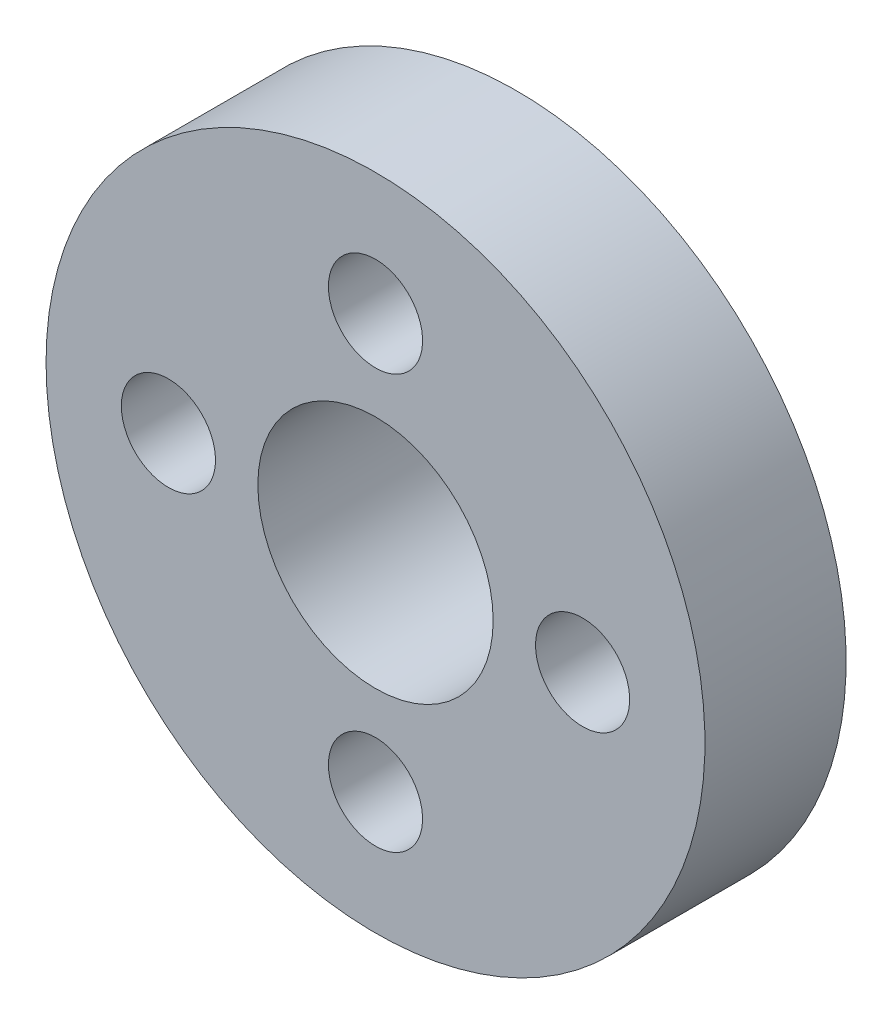
ISO-10303-21;
HEADER;
FILE_DESCRIPTION(('STEP AP214'),'2;1');
FILE_NAME('part.step','',(''),(''),'','','');
FILE_SCHEMA(('AUTOMOTIVE_DESIGN { 1 0 10303 214 1 1 1 1 }'));
ENDSEC;
DATA;
#1=APPLICATION_CONTEXT('core data for automotive mechanical design processes');
#2=APPLICATION_PROTOCOL_DEFINITION('international standard','automotive_design',2000,#1);
#3=PRODUCT_CONTEXT('',#1,'mechanical');
#4=PRODUCT('Part','Part','',(#3));
#5=PRODUCT_RELATED_PRODUCT_CATEGORY('part','',(#4));
#6=PRODUCT_DEFINITION_FORMATION('','',#4);
#7=PRODUCT_DEFINITION_CONTEXT('part definition',#1,'design');
#8=PRODUCT_DEFINITION('design','',#6,#7);
#9=PRODUCT_DEFINITION_SHAPE('','',#8);
#10=(LENGTH_UNIT() NAMED_UNIT(*) SI_UNIT(.MILLI.,.METRE.));
#11=(NAMED_UNIT(*) PLANE_ANGLE_UNIT() SI_UNIT($,.RADIAN.));
#12=(NAMED_UNIT(*) SI_UNIT($,.STERADIAN.) SOLID_ANGLE_UNIT());
#13=UNCERTAINTY_MEASURE_WITH_UNIT(LENGTH_MEASURE(1.E-05),#10,'distance_accuracy_value','');
#14=(GEOMETRIC_REPRESENTATION_CONTEXT(3) GLOBAL_UNCERTAINTY_ASSIGNED_CONTEXT((#13)) GLOBAL_UNIT_ASSIGNED_CONTEXT((#10,
#11,#12)) REPRESENTATION_CONTEXT('',''));
#15=CARTESIAN_POINT('',(0.,0.,0.));
#16=DIRECTION('',(0.,0.,1.));
#17=DIRECTION('',(1.,0.,0.));
#18=AXIS2_PLACEMENT_3D('',#15,#16,#17);
#19=CARTESIAN_POINT('',(0.,0.,0.));
#20=DIRECTION('',(0.,0.,1.));
#21=DIRECTION('',(1.,0.,0.));
#22=AXIS2_PLACEMENT_3D('',#19,#20,#21);
#23=PLANE('',#22);
#24=CARTESIAN_POINT('',(0.,-11.176,0.));
#25=DIRECTION('',(0.,0.,1.));
#26=DIRECTION('',(1.,0.,0.));
#27=AXIS2_PLACEMENT_3D('',#24,#25,#26);
#28=CIRCLE('',#27,2.54);
#29=CARTESIAN_POINT('',(-2.54,-11.176,0.));
#30=VERTEX_POINT('',#29);
#31=EDGE_CURVE('E96',#30,#30,#28,.T.);
#32=ORIENTED_EDGE('',*,*,#31,.T.);
#33=EDGE_LOOP('',(#32));
#34=FACE_BOUND('',#33,.T.);
#35=CARTESIAN_POINT('',(0.,11.176,0.));
#36=DIRECTION('',(0.,0.,1.));
#37=DIRECTION('',(1.,0.,0.));
#38=AXIS2_PLACEMENT_3D('',#35,#36,#37);
#39=CIRCLE('',#38,2.54);
#40=CARTESIAN_POINT('',(-2.54,11.176,0.));
#41=VERTEX_POINT('',#40);
#42=EDGE_CURVE('E106',#41,#41,#39,.T.);
#43=ORIENTED_EDGE('',*,*,#42,.T.);
#44=EDGE_LOOP('',(#43));
#45=FACE_BOUND('',#44,.T.);
#46=CARTESIAN_POINT('',(11.176,0.,0.));
#47=DIRECTION('',(0.,0.,1.));
#48=DIRECTION('',(1.,0.,0.));
#49=AXIS2_PLACEMENT_3D('',#46,#47,#48);
#50=CIRCLE('',#49,2.54);
#51=CARTESIAN_POINT('',(8.636,0.,0.));
#52=VERTEX_POINT('',#51);
#53=EDGE_CURVE('E111',#52,#52,#50,.T.);
#54=ORIENTED_EDGE('',*,*,#53,.T.);
#55=EDGE_LOOP('',(#54));
#56=FACE_BOUND('',#55,.T.);
#57=CARTESIAN_POINT('',(-11.176,0.,0.));
#58=DIRECTION('',(0.,0.,1.));
#59=DIRECTION('',(1.,0.,0.));
#60=AXIS2_PLACEMENT_3D('',#57,#58,#59);
#61=CIRCLE('',#60,2.54);
#62=CARTESIAN_POINT('',(-13.716,0.,0.));
#63=VERTEX_POINT('',#62);
#64=EDGE_CURVE('E117',#63,#63,#61,.T.);
#65=ORIENTED_EDGE('',*,*,#64,.T.);
#66=EDGE_LOOP('',(#65));
#67=FACE_BOUND('',#66,.T.);
#68=CARTESIAN_POINT('',(0.,0.,0.));
#69=DIRECTION('',(0.,0.,1.));
#70=DIRECTION('',(1.,0.,0.));
#71=AXIS2_PLACEMENT_3D('',#68,#69,#70);
#72=CIRCLE('',#71,17.78);
#73=CARTESIAN_POINT('',(-17.78,0.,0.));
#74=VERTEX_POINT('',#73);
#75=EDGE_CURVE('E37',#74,#74,#72,.T.);
#76=ORIENTED_EDGE('',*,*,#75,.F.);
#77=EDGE_LOOP('',(#76));
#78=FACE_BOUND('',#77,.T.);
#79=DIRECTION('',(0.,1.,0.));
#80=VECTOR('',#79,1.);
#81=CARTESIAN_POINT('',(-8.255,-8.255,0.));
#82=LINE('',#81,#80);
#83=CARTESIAN_POINT('',(-8.255,-8.255,0.));
#84=VERTEX_POINT('',#83);
#85=CARTESIAN_POINT('',(-8.255,8.255,0.));
#86=VERTEX_POINT('',#85);
#87=EDGE_CURVE('E95',#84,#86,#82,.T.);
#88=ORIENTED_EDGE('',*,*,#87,.F.);
#89=DIRECTION('',(-1.,0.,0.));
#90=VECTOR('',#89,1.);
#91=CARTESIAN_POINT('',(8.255,-8.255,0.));
#92=LINE('',#91,#90);
#93=CARTESIAN_POINT('',(8.255,-8.255,0.));
#94=VERTEX_POINT('',#93);
#95=EDGE_CURVE('E92',#94,#84,#92,.T.);
#96=ORIENTED_EDGE('',*,*,#95,.F.);
#97=DIRECTION('',(0.,-1.,0.));
#98=VECTOR('',#97,1.);
#99=CARTESIAN_POINT('',(8.255,-8.255,0.));
#100=LINE('',#99,#98);
#101=CARTESIAN_POINT('',(8.255,8.255,0.));
#102=VERTEX_POINT('',#101);
#103=EDGE_CURVE('E53',#102,#94,#100,.T.);
#104=ORIENTED_EDGE('',*,*,#103,.F.);
#105=DIRECTION('',(1.,0.,0.));
#106=VECTOR('',#105,1.);
#107=CARTESIAN_POINT('',(8.255,8.255,0.));
#108=LINE('',#107,#106);
#109=EDGE_CURVE('E48',#86,#102,#108,.T.);
#110=ORIENTED_EDGE('',*,*,#109,.F.);
#111=EDGE_LOOP('',(#88,#96,#104,#110));
#112=FACE_BOUND('',#111,.T.);
#113=ADVANCED_FACE('F33',(#34,#45,#56,#67,#78,#112),#23,.F.);
#114=CARTESIAN_POINT('',(0.,0.,7.62));
#115=DIRECTION('',(0.,0.,1.));
#116=DIRECTION('',(1.,0.,0.));
#117=AXIS2_PLACEMENT_3D('',#114,#115,#116);
#118=PLANE('',#117);
#119=CARTESIAN_POINT('',(0.,11.176,7.62));
#120=DIRECTION('',(0.,0.,1.));
#121=DIRECTION('',(1.,0.,0.));
#122=AXIS2_PLACEMENT_3D('',#119,#120,#121);
#123=CIRCLE('',#122,2.54);
#124=CARTESIAN_POINT('',(-2.54,11.176,7.62));
#125=VERTEX_POINT('',#124);
#126=EDGE_CURVE('E108',#125,#125,#123,.T.);
#127=ORIENTED_EDGE('',*,*,#126,.F.);
#128=EDGE_LOOP('',(#127));
#129=FACE_BOUND('',#128,.T.);
#130=CARTESIAN_POINT('',(-11.176,0.,7.62));
#131=DIRECTION('',(0.,0.,1.));
#132=DIRECTION('',(1.,0.,0.));
#133=AXIS2_PLACEMENT_3D('',#130,#131,#132);
#134=CIRCLE('',#133,2.54);
#135=CARTESIAN_POINT('',(-13.716,0.,7.62));
#136=VERTEX_POINT('',#135);
#137=EDGE_CURVE('E120',#136,#136,#134,.T.);
#138=ORIENTED_EDGE('',*,*,#137,.F.);
#139=EDGE_LOOP('',(#138));
#140=FACE_BOUND('',#139,.T.);
#141=CARTESIAN_POINT('',(0.,0.,7.62));
#142=DIRECTION('',(0.,0.,1.));
#143=DIRECTION('',(1.,0.,0.));
#144=AXIS2_PLACEMENT_3D('',#141,#142,#143);
#145=CIRCLE('',#144,17.78);
#146=CARTESIAN_POINT('',(-17.78,0.,7.62));
#147=VERTEX_POINT('',#146);
#148=EDGE_CURVE('E11',#147,#147,#145,.T.);
#149=ORIENTED_EDGE('',*,*,#148,.T.);
#150=EDGE_LOOP('',(#149));
#151=FACE_BOUND('',#150,.T.);
#152=CARTESIAN_POINT('',(0.,0.,7.62));
#153=DIRECTION('',(0.,0.,1.));
#154=DIRECTION('',(1.,0.,0.));
#155=AXIS2_PLACEMENT_3D('',#152,#153,#154);
#156=CIRCLE('',#155,6.35);
#157=CARTESIAN_POINT('',(-6.35,0.,7.62));
#158=VERTEX_POINT('',#157);
#159=EDGE_CURVE('E123',#158,#158,#156,.T.);
#160=ORIENTED_EDGE('',*,*,#159,.F.);
#161=EDGE_LOOP('',(#160));
#162=FACE_BOUND('',#161,.T.);
#163=CARTESIAN_POINT('',(11.176,0.,7.62));
#164=DIRECTION('',(0.,0.,1.));
#165=DIRECTION('',(1.,0.,0.));
#166=AXIS2_PLACEMENT_3D('',#163,#164,#165);
#167=CIRCLE('',#166,2.54);
#168=CARTESIAN_POINT('',(8.636,0.,7.62));
#169=VERTEX_POINT('',#168);
#170=EDGE_CURVE('E114',#169,#169,#167,.T.);
#171=ORIENTED_EDGE('',*,*,#170,.F.);
#172=EDGE_LOOP('',(#171));
#173=FACE_BOUND('',#172,.T.);
#174=CARTESIAN_POINT('',(0.,-11.176,7.62));
#175=DIRECTION('',(0.,0.,1.));
#176=DIRECTION('',(1.,0.,0.));
#177=AXIS2_PLACEMENT_3D('',#174,#175,#176);
#178=CIRCLE('',#177,2.54);
#179=CARTESIAN_POINT('',(-2.54,-11.176,7.62));
#180=VERTEX_POINT('',#179);
#181=EDGE_CURVE('E99',#180,#180,#178,.T.);
#182=ORIENTED_EDGE('',*,*,#181,.F.);
#183=EDGE_LOOP('',(#182));
#184=FACE_BOUND('',#183,.T.);
#185=ADVANCED_FACE('F134',(#129,#140,#151,#162,#173,#184),#118,.T.);
#186=CARTESIAN_POINT('',(0.,0.,7.62));
#187=DIRECTION('',(0.,0.,-1.));
#188=DIRECTION('',(-1.,0.,0.));
#189=AXIS2_PLACEMENT_3D('',#186,#187,#188);
#190=CYLINDRICAL_SURFACE('',#189,17.78);
#191=CARTESIAN_POINT('',(-17.78,0.,7.62));
#192=CARTESIAN_POINT('',(-17.78,0.,7.540625));
#193=CARTESIAN_POINT('',(-17.78,0.,7.46125));
#194=CARTESIAN_POINT('',(-17.78,0.,7.3025));
#195=CARTESIAN_POINT('',(-17.78,0.,7.223125));
#196=CARTESIAN_POINT('',(-17.78,0.,7.064375));
#197=CARTESIAN_POINT('',(-17.78,0.,6.985));
#198=CARTESIAN_POINT('',(-17.78,0.,6.82625));
#199=CARTESIAN_POINT('',(-17.78,0.,6.746875));
#200=CARTESIAN_POINT('',(-17.78,0.,6.588125));
#201=CARTESIAN_POINT('',(-17.78,0.,6.50875));
#202=CARTESIAN_POINT('',(-17.78,0.,6.35));
#203=CARTESIAN_POINT('',(-17.78,0.,6.270625));
#204=CARTESIAN_POINT('',(-17.78,0.,6.111875));
#205=CARTESIAN_POINT('',(-17.78,0.,6.0325));
#206=CARTESIAN_POINT('',(-17.78,0.,5.87375));
#207=CARTESIAN_POINT('',(-17.78,0.,5.794375));
#208=CARTESIAN_POINT('',(-17.78,0.,5.635625));
#209=CARTESIAN_POINT('',(-17.78,0.,5.55625));
#210=CARTESIAN_POINT('',(-17.78,0.,5.3975));
#211=CARTESIAN_POINT('',(-17.78,0.,5.318125));
#212=CARTESIAN_POINT('',(-17.78,0.,5.159375));
#213=CARTESIAN_POINT('',(-17.78,0.,5.08));
#214=CARTESIAN_POINT('',(-17.78,0.,4.92125));
#215=CARTESIAN_POINT('',(-17.78,0.,4.841875));
#216=CARTESIAN_POINT('',(-17.78,0.,4.683125));
#217=CARTESIAN_POINT('',(-17.78,0.,4.60375));
#218=CARTESIAN_POINT('',(-17.78,0.,4.445));
#219=CARTESIAN_POINT('',(-17.78,0.,4.365625));
#220=CARTESIAN_POINT('',(-17.78,0.,4.206875));
#221=CARTESIAN_POINT('',(-17.78,0.,4.1275));
#222=CARTESIAN_POINT('',(-17.78,0.,3.96875));
#223=CARTESIAN_POINT('',(-17.78,0.,3.889375));
#224=CARTESIAN_POINT('',(-17.78,0.,3.730625));
#225=CARTESIAN_POINT('',(-17.78,0.,3.65125));
#226=CARTESIAN_POINT('',(-17.78,0.,3.4925));
#227=CARTESIAN_POINT('',(-17.78,0.,3.413125));
#228=CARTESIAN_POINT('',(-17.78,0.,3.254375));
#229=CARTESIAN_POINT('',(-17.78,0.,3.175));
#230=CARTESIAN_POINT('',(-17.78,0.,3.01625));
#231=CARTESIAN_POINT('',(-17.78,0.,2.936875));
#232=CARTESIAN_POINT('',(-17.78,0.,2.778125));
#233=CARTESIAN_POINT('',(-17.78,0.,2.69875));
#234=CARTESIAN_POINT('',(-17.78,0.,2.54));
#235=CARTESIAN_POINT('',(-17.78,0.,2.460625));
#236=CARTESIAN_POINT('',(-17.78,0.,2.301875));
#237=CARTESIAN_POINT('',(-17.78,0.,2.2225));
#238=CARTESIAN_POINT('',(-17.78,0.,2.06375));
#239=CARTESIAN_POINT('',(-17.78,0.,1.984375));
#240=CARTESIAN_POINT('',(-17.78,0.,1.825625));
#241=CARTESIAN_POINT('',(-17.78,0.,1.74625));
#242=CARTESIAN_POINT('',(-17.78,0.,1.5875));
#243=CARTESIAN_POINT('',(-17.78,0.,1.508125));
#244=CARTESIAN_POINT('',(-17.78,0.,1.349375));
#245=CARTESIAN_POINT('',(-17.78,0.,1.27));
#246=CARTESIAN_POINT('',(-17.78,0.,1.11125));
#247=CARTESIAN_POINT('',(-17.78,0.,1.031875));
#248=CARTESIAN_POINT('',(-17.78,0.,0.873125));
#249=CARTESIAN_POINT('',(-17.78,0.,0.79375));
#250=CARTESIAN_POINT('',(-17.78,0.,0.635));
#251=CARTESIAN_POINT('',(-17.78,0.,0.555625));
#252=CARTESIAN_POINT('',(-17.78,0.,0.396875));
#253=CARTESIAN_POINT('',(-17.78,0.,0.3175));
#254=CARTESIAN_POINT('',(-17.78,0.,0.15875));
#255=CARTESIAN_POINT('',(-17.78,0.,0.0793749999999999));
#256=CARTESIAN_POINT('',(-17.78,0.,0.));
#257=B_SPLINE_CURVE_WITH_KNOTS('',3,(#191,#192,#193,#194,#195,#196,#197,#198,#199,#200,#201,
#202,#203,#204,#205,#206,#207,#208,#209,#210,#211,#212,#213,#214,#215,#216,#217,#218,#219,#220,
#221,#222,#223,#224,#225,#226,#227,#228,#229,#230,#231,#232,#233,#234,#235,#236,#237,#238,#239,
#240,#241,#242,#243,#244,#245,#246,#247,#248,#249,#250,#251,#252,#253,#254,#255,#256),
.UNSPECIFIED.,.F.,.F.,(4,2,2,2,2,2,2,2,2,2,2,2,2,2,2,2,2,2,2,2,2,2,2,2,2,2,2,2,2,2,2,2,4),(0.,
0.238125,0.47625,0.714375000000001,0.9525,1.190625,1.42875,1.666875,1.905,2.143125,2.38125,
2.619375,2.8575,3.095625,3.33375,3.571875,3.81,4.048125,4.28625,4.524375,4.7625,5.000625,
5.23875,5.476875,5.715,5.953125,6.19125,6.429375,6.6675,6.905625,7.14375,7.381875,7.62),.UNSPECIFIED.);
#258=EDGE_CURVE('BSEAM35',#147,#74,#257,.T.);
#259=ORIENTED_EDGE('',*,*,#148,.F.);
#260=ORIENTED_EDGE('',*,*,#75,.T.);
#261=ORIENTED_EDGE('',*,*,#258,.T.);
#262=ORIENTED_EDGE('',*,*,#258,.F.);
#263=EDGE_LOOP('',(#259,#261,#260,#262));
#264=FACE_BOUND('',#263,.T.);
#265=ADVANCED_FACE('F35',(#264),#190,.T.);
#266=CARTESIAN_POINT('',(0.,0.,7.62));
#267=DIRECTION('',(0.,0.,-1.));
#268=DIRECTION('',(-1.,0.,0.));
#269=AXIS2_PLACEMENT_3D('',#266,#267,#268);
#270=CYLINDRICAL_SURFACE('',#269,6.35);
#271=CARTESIAN_POINT('',(0.,0.,-3.175));
#272=DIRECTION('',(0.,0.,-1.));
#273=DIRECTION('',(-1.,0.,0.));
#274=AXIS2_PLACEMENT_3D('',#271,#272,#273);
#275=CIRCLE('',#274,6.35);
#276=CARTESIAN_POINT('',(-6.35,0.,-3.175));
#277=VERTEX_POINT('',#276);
#278=EDGE_CURVE('E137',#277,#277,#275,.T.);
#279=CARTESIAN_POINT('',(-6.35,0.,7.62));
#280=CARTESIAN_POINT('',(-6.35,0.,7.50755208333333));
#281=CARTESIAN_POINT('',(-6.35,0.,7.39510416666667));
#282=CARTESIAN_POINT('',(-6.35,0.,7.17020833333333));
#283=CARTESIAN_POINT('',(-6.35,0.,7.05776041666667));
#284=CARTESIAN_POINT('',(-6.35,0.,6.83286458333333));
#285=CARTESIAN_POINT('',(-6.35,0.,6.72041666666667));
#286=CARTESIAN_POINT('',(-6.35,0.,6.49552083333333));
#287=CARTESIAN_POINT('',(-6.35,0.,6.38307291666667));
#288=CARTESIAN_POINT('',(-6.35,0.,6.15817708333333));
#289=CARTESIAN_POINT('',(-6.35,0.,6.04572916666667));
#290=CARTESIAN_POINT('',(-6.35,0.,5.82083333333333));
#291=CARTESIAN_POINT('',(-6.35,0.,5.70838541666667));
#292=CARTESIAN_POINT('',(-6.35,0.,5.48348958333333));
#293=CARTESIAN_POINT('',(-6.35,0.,5.37104166666667));
#294=CARTESIAN_POINT('',(-6.35,0.,5.14614583333333));
#295=CARTESIAN_POINT('',(-6.35,0.,5.03369791666667));
#296=CARTESIAN_POINT('',(-6.35,0.,4.80880208333333));
#297=CARTESIAN_POINT('',(-6.35,0.,4.69635416666667));
#298=CARTESIAN_POINT('',(-6.35,0.,4.47145833333333));
#299=CARTESIAN_POINT('',(-6.35,0.,4.35901041666667));
#300=CARTESIAN_POINT('',(-6.35,0.,4.13411458333333));
#301=CARTESIAN_POINT('',(-6.35,0.,4.02166666666667));
#302=CARTESIAN_POINT('',(-6.35,0.,3.79677083333333));
#303=CARTESIAN_POINT('',(-6.35,0.,3.68432291666667));
#304=CARTESIAN_POINT('',(-6.35,0.,3.45942708333333));
#305=CARTESIAN_POINT('',(-6.35,0.,3.34697916666667));
#306=CARTESIAN_POINT('',(-6.35,0.,3.12208333333333));
#307=CARTESIAN_POINT('',(-6.35,0.,3.00963541666667));
#308=CARTESIAN_POINT('',(-6.35,0.,2.78473958333333));
#309=CARTESIAN_POINT('',(-6.35,0.,2.67229166666667));
#310=CARTESIAN_POINT('',(-6.35,0.,2.44739583333333));
#311=CARTESIAN_POINT('',(-6.35,0.,2.33494791666667));
#312=CARTESIAN_POINT('',(-6.35,0.,2.11005208333333));
#313=CARTESIAN_POINT('',(-6.35,0.,1.99760416666667));
#314=CARTESIAN_POINT('',(-6.35,0.,1.77270833333333));
#315=CARTESIAN_POINT('',(-6.35,0.,1.66026041666667));
#316=CARTESIAN_POINT('',(-6.35,0.,1.43536458333333));
#317=CARTESIAN_POINT('',(-6.35,0.,1.32291666666667));
#318=CARTESIAN_POINT('',(-6.35,0.,1.09802083333333));
#319=CARTESIAN_POINT('',(-6.35,0.,0.985572916666667));
#320=CARTESIAN_POINT('',(-6.35,0.,0.760677083333334));
#321=CARTESIAN_POINT('',(-6.35,0.,0.648229166666667));
#322=CARTESIAN_POINT('',(-6.35,0.,0.423333333333334));
#323=CARTESIAN_POINT('',(-6.35,0.,0.310885416666667));
#324=CARTESIAN_POINT('',(-6.35,0.,0.085989583333334));
#325=CARTESIAN_POINT('',(-6.35,0.,-0.0264583333333326));
#326=CARTESIAN_POINT('',(-6.35,0.,-0.251354166666666));
#327=CARTESIAN_POINT('',(-6.35,0.,-0.363802083333332));
#328=CARTESIAN_POINT('',(-6.35,0.,-0.588697916666665));
#329=CARTESIAN_POINT('',(-6.35,0.,-0.701145833333332));
#330=CARTESIAN_POINT('',(-6.35,0.,-0.926041666666665));
#331=CARTESIAN_POINT('',(-6.35,0.,-1.03848958333333));
#332=CARTESIAN_POINT('',(-6.35,0.,-1.26338541666667));
#333=CARTESIAN_POINT('',(-6.35,0.,-1.37583333333333));
#334=CARTESIAN_POINT('',(-6.35,0.,-1.60072916666666));
#335=CARTESIAN_POINT('',(-6.35,0.,-1.71317708333333));
#336=CARTESIAN_POINT('',(-6.35,0.,-1.93807291666667));
#337=CARTESIAN_POINT('',(-6.35,0.,-2.05052083333333));
#338=CARTESIAN_POINT('',(-6.35,0.,-2.27541666666666));
#339=CARTESIAN_POINT('',(-6.35,0.,-2.38786458333333));
#340=CARTESIAN_POINT('',(-6.35,0.,-2.61276041666666));
#341=CARTESIAN_POINT('',(-6.35,0.,-2.72520833333333));
#342=CARTESIAN_POINT('',(-6.35,0.,-2.95010416666666));
#343=CARTESIAN_POINT('',(-6.35,0.,-3.06255208333333));
#344=CARTESIAN_POINT('',(-6.35,0.,-3.175));
#345=B_SPLINE_CURVE_WITH_KNOTS('',3,(#279,#280,#281,#282,#283,#284,#285,#286,#287,#288,#289,
#290,#291,#292,#293,#294,#295,#296,#297,#298,#299,#300,#301,#302,#303,#304,#305,#306,#307,#308,
#309,#310,#311,#312,#313,#314,#315,#316,#317,#318,#319,#320,#321,#322,#323,#324,#325,#326,#327,
#328,#329,#330,#331,#332,#333,#334,#335,#336,#337,#338,#339,#340,#341,#342,#343,#344),
.UNSPECIFIED.,.F.,.F.,(4,2,2,2,2,2,2,2,2,2,2,2,2,2,2,2,2,2,2,2,2,2,2,2,2,2,2,2,2,2,2,2,4),(0.,
0.33734375,0.6746875,1.01203125,1.349375,1.68671875,2.0240625,2.36140625,2.69875,3.03609375,
3.3734375,3.71078125,4.048125,4.38546875,4.7228125,5.06015625,5.3975,5.73484375,6.0721875,
6.40953125,6.746875,7.08421875,7.4215625,7.75890625,8.09625,8.43359375,8.7709375,9.10828125,
9.445625,9.78296875,10.1203125,10.45765625,10.795),.UNSPECIFIED.);
#346=EDGE_CURVE('BSEAM154',#158,#277,#345,.T.);
#347=ORIENTED_EDGE('',*,*,#159,.T.);
#348=ORIENTED_EDGE('',*,*,#278,.T.);
#349=ORIENTED_EDGE('',*,*,#346,.T.);
#350=ORIENTED_EDGE('',*,*,#346,.F.);
#351=EDGE_LOOP('',(#347,#349,#348,#350));
#352=FACE_BOUND('',#351,.T.);
#353=ADVANCED_FACE('F154',(#352),#270,.F.);
#354=CARTESIAN_POINT('',(-11.176,0.,7.62));
#355=DIRECTION('',(0.,0.,-1.));
#356=DIRECTION('',(-1.,0.,0.));
#357=AXIS2_PLACEMENT_3D('',#354,#355,#356);
#358=CYLINDRICAL_SURFACE('',#357,2.54);
#359=CARTESIAN_POINT('',(-13.716,0.,7.62));
#360=CARTESIAN_POINT('',(-13.716,0.,7.540625));
#361=CARTESIAN_POINT('',(-13.716,0.,7.46125));
#362=CARTESIAN_POINT('',(-13.716,0.,7.3025));
#363=CARTESIAN_POINT('',(-13.716,0.,7.223125));
#364=CARTESIAN_POINT('',(-13.716,0.,7.064375));
#365=CARTESIAN_POINT('',(-13.716,0.,6.985));
#366=CARTESIAN_POINT('',(-13.716,0.,6.82625));
#367=CARTESIAN_POINT('',(-13.716,0.,6.746875));
#368=CARTESIAN_POINT('',(-13.716,0.,6.588125));
#369=CARTESIAN_POINT('',(-13.716,0.,6.50875));
#370=CARTESIAN_POINT('',(-13.716,0.,6.35));
#371=CARTESIAN_POINT('',(-13.716,0.,6.270625));
#372=CARTESIAN_POINT('',(-13.716,0.,6.111875));
#373=CARTESIAN_POINT('',(-13.716,0.,6.0325));
#374=CARTESIAN_POINT('',(-13.716,0.,5.87375));
#375=CARTESIAN_POINT('',(-13.716,0.,5.794375));
#376=CARTESIAN_POINT('',(-13.716,0.,5.635625));
#377=CARTESIAN_POINT('',(-13.716,0.,5.55625));
#378=CARTESIAN_POINT('',(-13.716,0.,5.3975));
#379=CARTESIAN_POINT('',(-13.716,0.,5.318125));
#380=CARTESIAN_POINT('',(-13.716,0.,5.159375));
#381=CARTESIAN_POINT('',(-13.716,0.,5.08));
#382=CARTESIAN_POINT('',(-13.716,0.,4.92125));
#383=CARTESIAN_POINT('',(-13.716,0.,4.841875));
#384=CARTESIAN_POINT('',(-13.716,0.,4.683125));
#385=CARTESIAN_POINT('',(-13.716,0.,4.60375));
#386=CARTESIAN_POINT('',(-13.716,0.,4.445));
#387=CARTESIAN_POINT('',(-13.716,0.,4.365625));
#388=CARTESIAN_POINT('',(-13.716,0.,4.206875));
#389=CARTESIAN_POINT('',(-13.716,0.,4.1275));
#390=CARTESIAN_POINT('',(-13.716,0.,3.96875));
#391=CARTESIAN_POINT('',(-13.716,0.,3.889375));
#392=CARTESIAN_POINT('',(-13.716,0.,3.730625));
#393=CARTESIAN_POINT('',(-13.716,0.,3.65125));
#394=CARTESIAN_POINT('',(-13.716,0.,3.4925));
#395=CARTESIAN_POINT('',(-13.716,0.,3.413125));
#396=CARTESIAN_POINT('',(-13.716,0.,3.254375));
#397=CARTESIAN_POINT('',(-13.716,0.,3.175));
#398=CARTESIAN_POINT('',(-13.716,0.,3.01625));
#399=CARTESIAN_POINT('',(-13.716,0.,2.936875));
#400=CARTESIAN_POINT('',(-13.716,0.,2.778125));
#401=CARTESIAN_POINT('',(-13.716,0.,2.69875));
#402=CARTESIAN_POINT('',(-13.716,0.,2.54));
#403=CARTESIAN_POINT('',(-13.716,0.,2.460625));
#404=CARTESIAN_POINT('',(-13.716,0.,2.301875));
#405=CARTESIAN_POINT('',(-13.716,0.,2.2225));
#406=CARTESIAN_POINT('',(-13.716,0.,2.06375));
#407=CARTESIAN_POINT('',(-13.716,0.,1.984375));
#408=CARTESIAN_POINT('',(-13.716,0.,1.825625));
#409=CARTESIAN_POINT('',(-13.716,0.,1.74625));
#410=CARTESIAN_POINT('',(-13.716,0.,1.5875));
#411=CARTESIAN_POINT('',(-13.716,0.,1.508125));
#412=CARTESIAN_POINT('',(-13.716,0.,1.349375));
#413=CARTESIAN_POINT('',(-13.716,0.,1.27));
#414=CARTESIAN_POINT('',(-13.716,0.,1.11125));
#415=CARTESIAN_POINT('',(-13.716,0.,1.031875));
#416=CARTESIAN_POINT('',(-13.716,0.,0.873125));
#417=CARTESIAN_POINT('',(-13.716,0.,0.79375));
#418=CARTESIAN_POINT('',(-13.716,0.,0.635));
#419=CARTESIAN_POINT('',(-13.716,0.,0.555625));
#420=CARTESIAN_POINT('',(-13.716,0.,0.396875));
#421=CARTESIAN_POINT('',(-13.716,0.,0.3175));
#422=CARTESIAN_POINT('',(-13.716,0.,0.15875));
#423=CARTESIAN_POINT('',(-13.716,0.,0.0793749999999999));
#424=CARTESIAN_POINT('',(-13.716,0.,0.));
#425=B_SPLINE_CURVE_WITH_KNOTS('',3,(#359,#360,#361,#362,#363,#364,#365,#366,#367,#368,#369,
#370,#371,#372,#373,#374,#375,#376,#377,#378,#379,#380,#381,#382,#383,#384,#385,#386,#387,#388,
#389,#390,#391,#392,#393,#394,#395,#396,#397,#398,#399,#400,#401,#402,#403,#404,#405,#406,#407,
#408,#409,#410,#411,#412,#413,#414,#415,#416,#417,#418,#419,#420,#421,#422,#423,#424),
.UNSPECIFIED.,.F.,.F.,(4,2,2,2,2,2,2,2,2,2,2,2,2,2,2,2,2,2,2,2,2,2,2,2,2,2,2,2,2,2,2,2,4),(0.,
0.238125,0.47625,0.714375000000001,0.9525,1.190625,1.42875,1.666875,1.905,2.143125,2.38125,
2.619375,2.8575,3.095625,3.33375,3.571875,3.81,4.048125,4.28625,4.524375,4.7625,5.000625,
5.23875,5.476875,5.715,5.953125,6.19125,6.429375,6.6675,6.905625,7.14375,7.381875,7.62),.UNSPECIFIED.);
#426=EDGE_CURVE('BSEAM181',#136,#63,#425,.T.);
#427=ORIENTED_EDGE('',*,*,#137,.T.);
#428=ORIENTED_EDGE('',*,*,#64,.F.);
#429=ORIENTED_EDGE('',*,*,#426,.T.);
#430=ORIENTED_EDGE('',*,*,#426,.F.);
#431=EDGE_LOOP('',(#427,#429,#428,#430));
#432=FACE_BOUND('',#431,.T.);
#433=ADVANCED_FACE('F181',(#432),#358,.F.);
#434=CARTESIAN_POINT('',(11.176,0.,7.62));
#435=DIRECTION('',(0.,0.,-1.));
#436=DIRECTION('',(-1.,0.,0.));
#437=AXIS2_PLACEMENT_3D('',#434,#435,#436);
#438=CYLINDRICAL_SURFACE('',#437,2.54);
#439=CARTESIAN_POINT('',(8.636,0.,7.62));
#440=CARTESIAN_POINT('',(8.636,0.,7.540625));
#441=CARTESIAN_POINT('',(8.636,0.,7.46125));
#442=CARTESIAN_POINT('',(8.636,0.,7.3025));
#443=CARTESIAN_POINT('',(8.636,0.,7.223125));
#444=CARTESIAN_POINT('',(8.636,0.,7.064375));
#445=CARTESIAN_POINT('',(8.636,0.,6.985));
#446=CARTESIAN_POINT('',(8.636,0.,6.82625));
#447=CARTESIAN_POINT('',(8.636,0.,6.746875));
#448=CARTESIAN_POINT('',(8.636,0.,6.588125));
#449=CARTESIAN_POINT('',(8.636,0.,6.50875));
#450=CARTESIAN_POINT('',(8.636,0.,6.35));
#451=CARTESIAN_POINT('',(8.636,0.,6.270625));
#452=CARTESIAN_POINT('',(8.636,0.,6.111875));
#453=CARTESIAN_POINT('',(8.636,0.,6.0325));
#454=CARTESIAN_POINT('',(8.636,0.,5.87375));
#455=CARTESIAN_POINT('',(8.636,0.,5.794375));
#456=CARTESIAN_POINT('',(8.636,0.,5.635625));
#457=CARTESIAN_POINT('',(8.636,0.,5.55625));
#458=CARTESIAN_POINT('',(8.636,0.,5.3975));
#459=CARTESIAN_POINT('',(8.636,0.,5.318125));
#460=CARTESIAN_POINT('',(8.636,0.,5.159375));
#461=CARTESIAN_POINT('',(8.636,0.,5.08));
#462=CARTESIAN_POINT('',(8.636,0.,4.92125));
#463=CARTESIAN_POINT('',(8.636,0.,4.841875));
#464=CARTESIAN_POINT('',(8.636,0.,4.683125));
#465=CARTESIAN_POINT('',(8.636,0.,4.60375));
#466=CARTESIAN_POINT('',(8.636,0.,4.445));
#467=CARTESIAN_POINT('',(8.636,0.,4.365625));
#468=CARTESIAN_POINT('',(8.636,0.,4.206875));
#469=CARTESIAN_POINT('',(8.636,0.,4.1275));
#470=CARTESIAN_POINT('',(8.636,0.,3.96875));
#471=CARTESIAN_POINT('',(8.636,0.,3.889375));
#472=CARTESIAN_POINT('',(8.636,0.,3.730625));
#473=CARTESIAN_POINT('',(8.636,0.,3.65125));
#474=CARTESIAN_POINT('',(8.636,0.,3.4925));
#475=CARTESIAN_POINT('',(8.636,0.,3.413125));
#476=CARTESIAN_POINT('',(8.636,0.,3.254375));
#477=CARTESIAN_POINT('',(8.636,0.,3.175));
#478=CARTESIAN_POINT('',(8.636,0.,3.01625));
#479=CARTESIAN_POINT('',(8.636,0.,2.936875));
#480=CARTESIAN_POINT('',(8.636,0.,2.778125));
#481=CARTESIAN_POINT('',(8.636,0.,2.69875));
#482=CARTESIAN_POINT('',(8.636,0.,2.54));
#483=CARTESIAN_POINT('',(8.636,0.,2.460625));
#484=CARTESIAN_POINT('',(8.636,0.,2.301875));
#485=CARTESIAN_POINT('',(8.636,0.,2.2225));
#486=CARTESIAN_POINT('',(8.636,0.,2.06375));
#487=CARTESIAN_POINT('',(8.636,0.,1.984375));
#488=CARTESIAN_POINT('',(8.636,0.,1.825625));
#489=CARTESIAN_POINT('',(8.636,0.,1.74625));
#490=CARTESIAN_POINT('',(8.636,0.,1.5875));
#491=CARTESIAN_POINT('',(8.636,0.,1.508125));
#492=CARTESIAN_POINT('',(8.636,0.,1.349375));
#493=CARTESIAN_POINT('',(8.636,0.,1.27));
#494=CARTESIAN_POINT('',(8.636,0.,1.11125));
#495=CARTESIAN_POINT('',(8.636,0.,1.031875));
#496=CARTESIAN_POINT('',(8.636,0.,0.873125));
#497=CARTESIAN_POINT('',(8.636,0.,0.79375));
#498=CARTESIAN_POINT('',(8.636,0.,0.635));
#499=CARTESIAN_POINT('',(8.636,0.,0.555625));
#500=CARTESIAN_POINT('',(8.636,0.,0.396875));
#501=CARTESIAN_POINT('',(8.636,0.,0.3175));
#502=CARTESIAN_POINT('',(8.636,0.,0.15875));
#503=CARTESIAN_POINT('',(8.636,0.,0.0793749999999999));
#504=CARTESIAN_POINT('',(8.636,0.,0.));
#505=B_SPLINE_CURVE_WITH_KNOTS('',3,(#439,#440,#441,#442,#443,#444,#445,#446,#447,#448,#449,
#450,#451,#452,#453,#454,#455,#456,#457,#458,#459,#460,#461,#462,#463,#464,#465,#466,#467,#468,
#469,#470,#471,#472,#473,#474,#475,#476,#477,#478,#479,#480,#481,#482,#483,#484,#485,#486,#487,
#488,#489,#490,#491,#492,#493,#494,#495,#496,#497,#498,#499,#500,#501,#502,#503,#504),
.UNSPECIFIED.,.F.,.F.,(4,2,2,2,2,2,2,2,2,2,2,2,2,2,2,2,2,2,2,2,2,2,2,2,2,2,2,2,2,2,2,2,4),(0.,
0.238125,0.47625,0.714375000000001,0.9525,1.190625,1.42875,1.666875,1.905,2.143125,2.38125,
2.619375,2.8575,3.095625,3.33375,3.571875,3.81,4.048125,4.28625,4.524375,4.7625,5.000625,
5.23875,5.476875,5.715,5.953125,6.19125,6.429375,6.6675,6.905625,7.14375,7.381875,7.62),.UNSPECIFIED.);
#506=EDGE_CURVE('BSEAM177',#169,#52,#505,.T.);
#507=ORIENTED_EDGE('',*,*,#170,.T.);
#508=ORIENTED_EDGE('',*,*,#53,.F.);
#509=ORIENTED_EDGE('',*,*,#506,.T.);
#510=ORIENTED_EDGE('',*,*,#506,.F.);
#511=EDGE_LOOP('',(#507,#509,#508,#510));
#512=FACE_BOUND('',#511,.T.);
#513=ADVANCED_FACE('F177',(#512),#438,.F.);
#514=CARTESIAN_POINT('',(0.,11.176,7.62));
#515=DIRECTION('',(0.,0.,-1.));
#516=DIRECTION('',(-1.,0.,0.));
#517=AXIS2_PLACEMENT_3D('',#514,#515,#516);
#518=CYLINDRICAL_SURFACE('',#517,2.54);
#519=CARTESIAN_POINT('',(-2.54,11.176,7.62));
#520=CARTESIAN_POINT('',(-2.54,11.176,7.540625));
#521=CARTESIAN_POINT('',(-2.54,11.176,7.46125));
#522=CARTESIAN_POINT('',(-2.54,11.176,7.3025));
#523=CARTESIAN_POINT('',(-2.54,11.176,7.223125));
#524=CARTESIAN_POINT('',(-2.54,11.176,7.064375));
#525=CARTESIAN_POINT('',(-2.54,11.176,6.985));
#526=CARTESIAN_POINT('',(-2.54,11.176,6.82625));
#527=CARTESIAN_POINT('',(-2.54,11.176,6.746875));
#528=CARTESIAN_POINT('',(-2.54,11.176,6.588125));
#529=CARTESIAN_POINT('',(-2.54,11.176,6.50875));
#530=CARTESIAN_POINT('',(-2.54,11.176,6.35));
#531=CARTESIAN_POINT('',(-2.54,11.176,6.270625));
#532=CARTESIAN_POINT('',(-2.54,11.176,6.111875));
#533=CARTESIAN_POINT('',(-2.54,11.176,6.0325));
#534=CARTESIAN_POINT('',(-2.54,11.176,5.87375));
#535=CARTESIAN_POINT('',(-2.54,11.176,5.794375));
#536=CARTESIAN_POINT('',(-2.54,11.176,5.635625));
#537=CARTESIAN_POINT('',(-2.54,11.176,5.55625));
#538=CARTESIAN_POINT('',(-2.54,11.176,5.3975));
#539=CARTESIAN_POINT('',(-2.54,11.176,5.318125));
#540=CARTESIAN_POINT('',(-2.54,11.176,5.159375));
#541=CARTESIAN_POINT('',(-2.54,11.176,5.08));
#542=CARTESIAN_POINT('',(-2.54,11.176,4.92125));
#543=CARTESIAN_POINT('',(-2.54,11.176,4.841875));
#544=CARTESIAN_POINT('',(-2.54,11.176,4.683125));
#545=CARTESIAN_POINT('',(-2.54,11.176,4.60375));
#546=CARTESIAN_POINT('',(-2.54,11.176,4.445));
#547=CARTESIAN_POINT('',(-2.54,11.176,4.365625));
#548=CARTESIAN_POINT('',(-2.54,11.176,4.206875));
#549=CARTESIAN_POINT('',(-2.54,11.176,4.1275));
#550=CARTESIAN_POINT('',(-2.54,11.176,3.96875));
#551=CARTESIAN_POINT('',(-2.54,11.176,3.889375));
#552=CARTESIAN_POINT('',(-2.54,11.176,3.730625));
#553=CARTESIAN_POINT('',(-2.54,11.176,3.65125));
#554=CARTESIAN_POINT('',(-2.54,11.176,3.4925));
#555=CARTESIAN_POINT('',(-2.54,11.176,3.413125));
#556=CARTESIAN_POINT('',(-2.54,11.176,3.254375));
#557=CARTESIAN_POINT('',(-2.54,11.176,3.175));
#558=CARTESIAN_POINT('',(-2.54,11.176,3.01625));
#559=CARTESIAN_POINT('',(-2.54,11.176,2.936875));
#560=CARTESIAN_POINT('',(-2.54,11.176,2.778125));
#561=CARTESIAN_POINT('',(-2.54,11.176,2.69875));
#562=CARTESIAN_POINT('',(-2.54,11.176,2.54));
#563=CARTESIAN_POINT('',(-2.54,11.176,2.460625));
#564=CARTESIAN_POINT('',(-2.54,11.176,2.301875));
#565=CARTESIAN_POINT('',(-2.54,11.176,2.2225));
#566=CARTESIAN_POINT('',(-2.54,11.176,2.06375));
#567=CARTESIAN_POINT('',(-2.54,11.176,1.984375));
#568=CARTESIAN_POINT('',(-2.54,11.176,1.825625));
#569=CARTESIAN_POINT('',(-2.54,11.176,1.74625));
#570=CARTESIAN_POINT('',(-2.54,11.176,1.5875));
#571=CARTESIAN_POINT('',(-2.54,11.176,1.508125));
#572=CARTESIAN_POINT('',(-2.54,11.176,1.349375));
#573=CARTESIAN_POINT('',(-2.54,11.176,1.27));
#574=CARTESIAN_POINT('',(-2.54,11.176,1.11125));
#575=CARTESIAN_POINT('',(-2.54,11.176,1.031875));
#576=CARTESIAN_POINT('',(-2.54,11.176,0.873125));
#577=CARTESIAN_POINT('',(-2.54,11.176,0.79375));
#578=CARTESIAN_POINT('',(-2.54,11.176,0.635));
#579=CARTESIAN_POINT('',(-2.54,11.176,0.555625));
#580=CARTESIAN_POINT('',(-2.54,11.176,0.396875));
#581=CARTESIAN_POINT('',(-2.54,11.176,0.3175));
#582=CARTESIAN_POINT('',(-2.54,11.176,0.15875));
#583=CARTESIAN_POINT('',(-2.54,11.176,0.0793749999999999));
#584=CARTESIAN_POINT('',(-2.54,11.176,0.));
#585=B_SPLINE_CURVE_WITH_KNOTS('',3,(#519,#520,#521,#522,#523,#524,#525,#526,#527,#528,#529,
#530,#531,#532,#533,#534,#535,#536,#537,#538,#539,#540,#541,#542,#543,#544,#545,#546,#547,#548,
#549,#550,#551,#552,#553,#554,#555,#556,#557,#558,#559,#560,#561,#562,#563,#564,#565,#566,#567,
#568,#569,#570,#571,#572,#573,#574,#575,#576,#577,#578,#579,#580,#581,#582,#583,#584),
.UNSPECIFIED.,.F.,.F.,(4,2,2,2,2,2,2,2,2,2,2,2,2,2,2,2,2,2,2,2,2,2,2,2,2,2,2,2,2,2,2,2,4),(0.,
0.238125,0.47625,0.714375000000001,0.9525,1.190625,1.42875,1.666875,1.905,2.143125,2.38125,
2.619375,2.8575,3.095625,3.33375,3.571875,3.81,4.048125,4.28625,4.524375,4.7625,5.000625,
5.23875,5.476875,5.715,5.953125,6.19125,6.429375,6.6675,6.905625,7.14375,7.381875,7.62),.UNSPECIFIED.);
#586=EDGE_CURVE('BSEAM163',#125,#41,#585,.T.);
#587=ORIENTED_EDGE('',*,*,#126,.T.);
#588=ORIENTED_EDGE('',*,*,#42,.F.);
#589=ORIENTED_EDGE('',*,*,#586,.T.);
#590=ORIENTED_EDGE('',*,*,#586,.F.);
#591=EDGE_LOOP('',(#587,#589,#588,#590));
#592=FACE_BOUND('',#591,.T.);
#593=ADVANCED_FACE('F163',(#592),#518,.F.);
#594=CARTESIAN_POINT('',(0.,-11.176,7.62));
#595=DIRECTION('',(0.,0.,-1.));
#596=DIRECTION('',(-1.,0.,0.));
#597=AXIS2_PLACEMENT_3D('',#594,#595,#596);
#598=CYLINDRICAL_SURFACE('',#597,2.54);
#599=CARTESIAN_POINT('',(-2.54,-11.176,7.62));
#600=CARTESIAN_POINT('',(-2.54,-11.176,7.540625));
#601=CARTESIAN_POINT('',(-2.54,-11.176,7.46125));
#602=CARTESIAN_POINT('',(-2.54,-11.176,7.3025));
#603=CARTESIAN_POINT('',(-2.54,-11.176,7.223125));
#604=CARTESIAN_POINT('',(-2.54,-11.176,7.064375));
#605=CARTESIAN_POINT('',(-2.54,-11.176,6.985));
#606=CARTESIAN_POINT('',(-2.54,-11.176,6.82625));
#607=CARTESIAN_POINT('',(-2.54,-11.176,6.746875));
#608=CARTESIAN_POINT('',(-2.54,-11.176,6.588125));
#609=CARTESIAN_POINT('',(-2.54,-11.176,6.50875));
#610=CARTESIAN_POINT('',(-2.54,-11.176,6.35));
#611=CARTESIAN_POINT('',(-2.54,-11.176,6.270625));
#612=CARTESIAN_POINT('',(-2.54,-11.176,6.111875));
#613=CARTESIAN_POINT('',(-2.54,-11.176,6.0325));
#614=CARTESIAN_POINT('',(-2.54,-11.176,5.87375));
#615=CARTESIAN_POINT('',(-2.54,-11.176,5.794375));
#616=CARTESIAN_POINT('',(-2.54,-11.176,5.635625));
#617=CARTESIAN_POINT('',(-2.54,-11.176,5.55625));
#618=CARTESIAN_POINT('',(-2.54,-11.176,5.3975));
#619=CARTESIAN_POINT('',(-2.54,-11.176,5.318125));
#620=CARTESIAN_POINT('',(-2.54,-11.176,5.159375));
#621=CARTESIAN_POINT('',(-2.54,-11.176,5.08));
#622=CARTESIAN_POINT('',(-2.54,-11.176,4.92125));
#623=CARTESIAN_POINT('',(-2.54,-11.176,4.841875));
#624=CARTESIAN_POINT('',(-2.54,-11.176,4.683125));
#625=CARTESIAN_POINT('',(-2.54,-11.176,4.60375));
#626=CARTESIAN_POINT('',(-2.54,-11.176,4.445));
#627=CARTESIAN_POINT('',(-2.54,-11.176,4.365625));
#628=CARTESIAN_POINT('',(-2.54,-11.176,4.206875));
#629=CARTESIAN_POINT('',(-2.54,-11.176,4.1275));
#630=CARTESIAN_POINT('',(-2.54,-11.176,3.96875));
#631=CARTESIAN_POINT('',(-2.54,-11.176,3.889375));
#632=CARTESIAN_POINT('',(-2.54,-11.176,3.730625));
#633=CARTESIAN_POINT('',(-2.54,-11.176,3.65125));
#634=CARTESIAN_POINT('',(-2.54,-11.176,3.4925));
#635=CARTESIAN_POINT('',(-2.54,-11.176,3.413125));
#636=CARTESIAN_POINT('',(-2.54,-11.176,3.254375));
#637=CARTESIAN_POINT('',(-2.54,-11.176,3.175));
#638=CARTESIAN_POINT('',(-2.54,-11.176,3.01625));
#639=CARTESIAN_POINT('',(-2.54,-11.176,2.936875));
#640=CARTESIAN_POINT('',(-2.54,-11.176,2.778125));
#641=CARTESIAN_POINT('',(-2.54,-11.176,2.69875));
#642=CARTESIAN_POINT('',(-2.54,-11.176,2.54));
#643=CARTESIAN_POINT('',(-2.54,-11.176,2.460625));
#644=CARTESIAN_POINT('',(-2.54,-11.176,2.301875));
#645=CARTESIAN_POINT('',(-2.54,-11.176,2.2225));
#646=CARTESIAN_POINT('',(-2.54,-11.176,2.06375));
#647=CARTESIAN_POINT('',(-2.54,-11.176,1.984375));
#648=CARTESIAN_POINT('',(-2.54,-11.176,1.825625));
#649=CARTESIAN_POINT('',(-2.54,-11.176,1.74625));
#650=CARTESIAN_POINT('',(-2.54,-11.176,1.5875));
#651=CARTESIAN_POINT('',(-2.54,-11.176,1.508125));
#652=CARTESIAN_POINT('',(-2.54,-11.176,1.349375));
#653=CARTESIAN_POINT('',(-2.54,-11.176,1.27));
#654=CARTESIAN_POINT('',(-2.54,-11.176,1.11125));
#655=CARTESIAN_POINT('',(-2.54,-11.176,1.031875));
#656=CARTESIAN_POINT('',(-2.54,-11.176,0.873125));
#657=CARTESIAN_POINT('',(-2.54,-11.176,0.79375));
#658=CARTESIAN_POINT('',(-2.54,-11.176,0.635));
#659=CARTESIAN_POINT('',(-2.54,-11.176,0.555625));
#660=CARTESIAN_POINT('',(-2.54,-11.176,0.396875));
#661=CARTESIAN_POINT('',(-2.54,-11.176,0.3175));
#662=CARTESIAN_POINT('',(-2.54,-11.176,0.15875));
#663=CARTESIAN_POINT('',(-2.54,-11.176,0.0793749999999999));
#664=CARTESIAN_POINT('',(-2.54,-11.176,0.));
#665=B_SPLINE_CURVE_WITH_KNOTS('',3,(#599,#600,#601,#602,#603,#604,#605,#606,#607,#608,#609,
#610,#611,#612,#613,#614,#615,#616,#617,#618,#619,#620,#621,#622,#623,#624,#625,#626,#627,#628,
#629,#630,#631,#632,#633,#634,#635,#636,#637,#638,#639,#640,#641,#642,#643,#644,#645,#646,#647,
#648,#649,#650,#651,#652,#653,#654,#655,#656,#657,#658,#659,#660,#661,#662,#663,#664),
.UNSPECIFIED.,.F.,.F.,(4,2,2,2,2,2,2,2,2,2,2,2,2,2,2,2,2,2,2,2,2,2,2,2,2,2,2,2,2,2,2,2,4),(0.,
0.238125,0.47625,0.714375000000001,0.9525,1.190625,1.42875,1.666875,1.905,2.143125,2.38125,
2.619375,2.8575,3.095625,3.33375,3.571875,3.81,4.048125,4.28625,4.524375,4.7625,5.000625,
5.23875,5.476875,5.715,5.953125,6.19125,6.429375,6.6675,6.905625,7.14375,7.381875,7.62),.UNSPECIFIED.);
#666=EDGE_CURVE('BSEAM156',#180,#30,#665,.T.);
#667=ORIENTED_EDGE('',*,*,#181,.T.);
#668=ORIENTED_EDGE('',*,*,#31,.F.);
#669=ORIENTED_EDGE('',*,*,#666,.T.);
#670=ORIENTED_EDGE('',*,*,#666,.F.);
#671=EDGE_LOOP('',(#667,#669,#668,#670));
#672=FACE_BOUND('',#671,.T.);
#673=ADVANCED_FACE('F156',(#672),#598,.F.);
#674=CARTESIAN_POINT('',(0.,0.,-3.175));
#675=DIRECTION('',(0.,0.,1.));
#676=DIRECTION('',(1.,0.,0.));
#677=AXIS2_PLACEMENT_3D('',#674,#675,#676);
#678=PLANE('',#677);
#679=DIRECTION('',(0.,1.,0.));
#680=VECTOR('',#679,1.);
#681=CARTESIAN_POINT('',(-8.255,-8.255,-3.175));
#682=LINE('',#681,#680);
#683=CARTESIAN_POINT('',(-8.255,-8.255,-3.175));
#684=VERTEX_POINT('',#683);
#685=CARTESIAN_POINT('',(-8.255,8.255,-3.175));
#686=VERTEX_POINT('',#685);
#687=EDGE_CURVE('E82',#684,#686,#682,.T.);
#688=ORIENTED_EDGE('',*,*,#687,.T.);
#689=DIRECTION('',(1.,0.,0.));
#690=VECTOR('',#689,1.);
#691=CARTESIAN_POINT('',(8.255,8.255,-3.175));
#692=LINE('',#691,#690);
#693=CARTESIAN_POINT('',(8.255,8.255,-3.175));
#694=VERTEX_POINT('',#693);
#695=EDGE_CURVE('E71',#686,#694,#692,.T.);
#696=ORIENTED_EDGE('',*,*,#695,.T.);
#697=DIRECTION('',(0.,-1.,0.));
#698=VECTOR('',#697,1.);
#699=CARTESIAN_POINT('',(8.255,-8.255,-3.175));
#700=LINE('',#699,#698);
#701=CARTESIAN_POINT('',(8.255,-8.255,-3.175));
#702=VERTEX_POINT('',#701);
#703=EDGE_CURVE('E81',#694,#702,#700,.T.);
#704=ORIENTED_EDGE('',*,*,#703,.T.);
#705=DIRECTION('',(-1.,0.,0.));
#706=VECTOR('',#705,1.);
#707=CARTESIAN_POINT('',(8.255,-8.255,-3.175));
#708=LINE('',#707,#706);
#709=EDGE_CURVE('E88',#702,#684,#708,.T.);
#710=ORIENTED_EDGE('',*,*,#709,.T.);
#711=EDGE_LOOP('',(#688,#696,#704,#710));
#712=FACE_BOUND('',#711,.T.);
#713=ORIENTED_EDGE('',*,*,#278,.F.);
#714=EDGE_LOOP('',(#713));
#715=FACE_BOUND('',#714,.T.);
#716=ADVANCED_FACE('F85',(#712,#715),#678,.F.);
#717=CARTESIAN_POINT('',(-8.255,-8.255,-3.175));
#718=DIRECTION('',(1.,0.,0.));
#719=DIRECTION('',(0.,0.,-1.));
#720=AXIS2_PLACEMENT_3D('',#717,#718,#719);
#721=PLANE('',#720);
#722=ORIENTED_EDGE('',*,*,#87,.T.);
#723=DIRECTION('',(0.,0.,1.));
#724=VECTOR('',#723,1.);
#725=CARTESIAN_POINT('',(-8.255,8.255,-3.175));
#726=LINE('',#725,#724);
#727=EDGE_CURVE('E75',#686,#86,#726,.T.);
#728=ORIENTED_EDGE('',*,*,#727,.F.);
#729=ORIENTED_EDGE('',*,*,#687,.F.);
#730=DIRECTION('',(0.,0.,1.));
#731=VECTOR('',#730,1.);
#732=CARTESIAN_POINT('',(-8.255,-8.255,-3.175));
#733=LINE('',#732,#731);
#734=EDGE_CURVE('E142',#684,#84,#733,.T.);
#735=ORIENTED_EDGE('',*,*,#734,.T.);
#736=EDGE_LOOP('',(#722,#728,#729,#735));
#737=FACE_BOUND('',#736,.T.);
#738=ADVANCED_FACE('F94',(#737),#721,.F.);
#739=CARTESIAN_POINT('',(8.255,8.255,-3.175));
#740=DIRECTION('',(0.,-1.,0.));
#741=DIRECTION('',(0.,0.,-1.));
#742=AXIS2_PLACEMENT_3D('',#739,#740,#741);
#743=PLANE('',#742);
#744=ORIENTED_EDGE('',*,*,#109,.T.);
#745=DIRECTION('',(0.,0.,1.));
#746=VECTOR('',#745,1.);
#747=CARTESIAN_POINT('',(8.255,8.255,-3.175));
#748=LINE('',#747,#746);
#749=EDGE_CURVE('E78',#694,#102,#748,.T.);
#750=ORIENTED_EDGE('',*,*,#749,.F.);
#751=ORIENTED_EDGE('',*,*,#695,.F.);
#752=ORIENTED_EDGE('',*,*,#727,.T.);
#753=EDGE_LOOP('',(#744,#750,#751,#752));
#754=FACE_BOUND('',#753,.T.);
#755=ADVANCED_FACE('F73',(#754),#743,.F.);
#756=CARTESIAN_POINT('',(8.255,-8.255,-3.175));
#757=DIRECTION('',(-1.,0.,0.));
#758=DIRECTION('',(0.,0.,1.));
#759=AXIS2_PLACEMENT_3D('',#756,#757,#758);
#760=PLANE('',#759);
#761=ORIENTED_EDGE('',*,*,#103,.T.);
#762=DIRECTION('',(0.,0.,1.));
#763=VECTOR('',#762,1.);
#764=CARTESIAN_POINT('',(8.255,-8.255,-3.175));
#765=LINE('',#764,#763);
#766=EDGE_CURVE('E101',#702,#94,#765,.T.);
#767=ORIENTED_EDGE('',*,*,#766,.F.);
#768=ORIENTED_EDGE('',*,*,#703,.F.);
#769=ORIENTED_EDGE('',*,*,#749,.T.);
#770=EDGE_LOOP('',(#761,#767,#768,#769));
#771=FACE_BOUND('',#770,.T.);
#772=ADVANCED_FACE('F169',(#771),#760,.F.);
#773=CARTESIAN_POINT('',(8.255,-8.255,-3.175));
#774=DIRECTION('',(0.,1.,0.));
#775=DIRECTION('',(0.,0.,1.));
#776=AXIS2_PLACEMENT_3D('',#773,#774,#775);
#777=PLANE('',#776);
#778=ORIENTED_EDGE('',*,*,#95,.T.);
#779=ORIENTED_EDGE('',*,*,#734,.F.);
#780=ORIENTED_EDGE('',*,*,#709,.F.);
#781=ORIENTED_EDGE('',*,*,#766,.T.);
#782=EDGE_LOOP('',(#778,#779,#780,#781));
#783=FACE_BOUND('',#782,.T.);
#784=ADVANCED_FACE('F141',(#783),#777,.F.);
#785=CLOSED_SHELL('',(#113,#185,#265,#353,#433,#513,#593,#673,#716,#738,#755,#772,#784));
#786=MANIFOLD_SOLID_BREP('B2',#785);
#787=ADVANCED_BREP_SHAPE_REPRESENTATION('',(#18,#786),#14);
#788=SHAPE_DEFINITION_REPRESENTATION(#9,#787);
ENDSEC;
END-ISO-10303-21;
